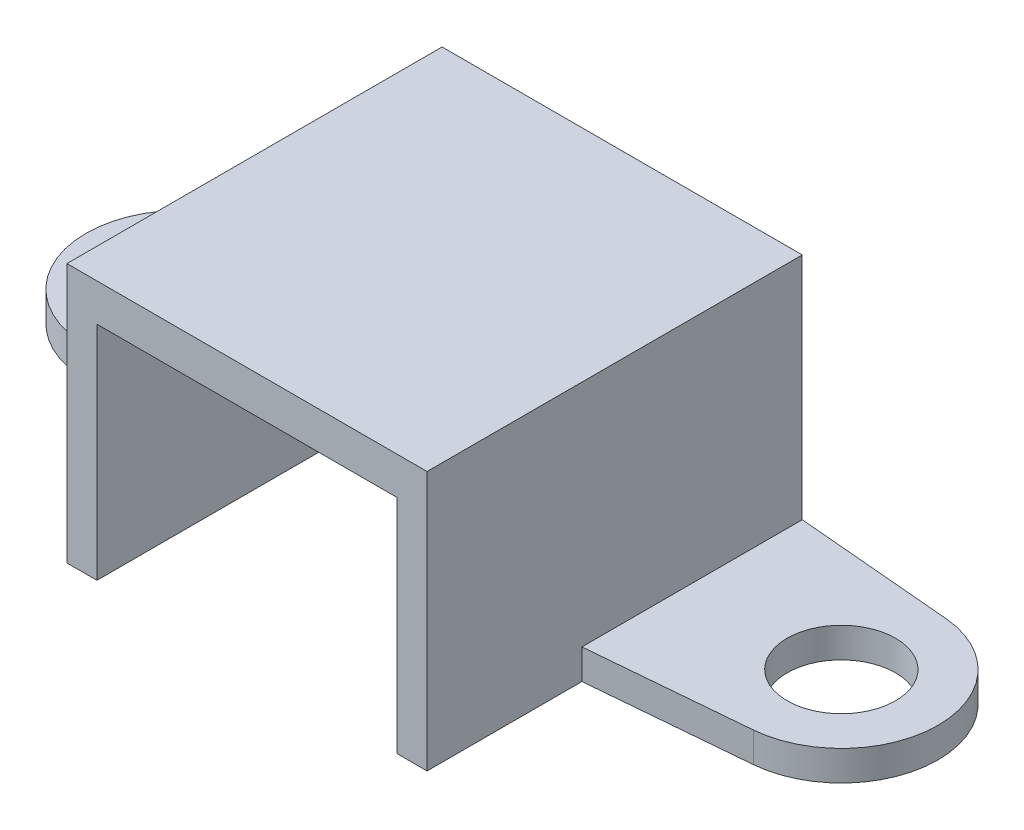
ISO-10303-21;
HEADER;
FILE_DESCRIPTION(('STEP AP214'),'2;1');
FILE_NAME('part.step','',(''),(''),'','','');
FILE_SCHEMA(('AUTOMOTIVE_DESIGN { 1 0 10303 214 1 1 1 1 }'));
ENDSEC;
DATA;
#1=APPLICATION_CONTEXT('core data for automotive mechanical design processes');
#2=APPLICATION_PROTOCOL_DEFINITION('international standard','automotive_design',2000,#1);
#3=PRODUCT_CONTEXT('',#1,'mechanical');
#4=PRODUCT('Part','Part','',(#3));
#5=PRODUCT_RELATED_PRODUCT_CATEGORY('part','',(#4));
#6=PRODUCT_DEFINITION_FORMATION('','',#4);
#7=PRODUCT_DEFINITION_CONTEXT('part definition',#1,'design');
#8=PRODUCT_DEFINITION('design','',#6,#7);
#9=PRODUCT_DEFINITION_SHAPE('','',#8);
#10=(LENGTH_UNIT() NAMED_UNIT(*) SI_UNIT(.MILLI.,.METRE.));
#11=(NAMED_UNIT(*) PLANE_ANGLE_UNIT() SI_UNIT($,.RADIAN.));
#12=(NAMED_UNIT(*) SI_UNIT($,.STERADIAN.) SOLID_ANGLE_UNIT());
#13=UNCERTAINTY_MEASURE_WITH_UNIT(LENGTH_MEASURE(1.E-05),#10,'distance_accuracy_value','');
#14=(GEOMETRIC_REPRESENTATION_CONTEXT(3) GLOBAL_UNCERTAINTY_ASSIGNED_CONTEXT((#13)) GLOBAL_UNIT_ASSIGNED_CONTEXT((#10,
#11,#12)) REPRESENTATION_CONTEXT('',''));
#15=CARTESIAN_POINT('',(0.,0.,0.));
#16=DIRECTION('',(0.,0.,1.));
#17=DIRECTION('',(1.,0.,0.));
#18=AXIS2_PLACEMENT_3D('',#15,#16,#17);
#19=CARTESIAN_POINT('',(1.2,0.,-15.));
#20=DIRECTION('',(0.,-1.,0.));
#21=DIRECTION('',(0.,0.,-1.));
#22=AXIS2_PLACEMENT_3D('',#19,#20,#21);
#23=PLANE('',#22);
#24=DIRECTION('',(1.,0.,0.));
#25=VECTOR('',#24,1.);
#26=CARTESIAN_POINT('',(1.2,0.,0.));
#27=LINE('',#26,#25);
#28=CARTESIAN_POINT('',(0.,0.,0.));
#29=VERTEX_POINT('',#28);
#30=CARTESIAN_POINT('',(1.2,0.,0.));
#31=VERTEX_POINT('',#30);
#32=EDGE_CURVE('E213',#29,#31,#27,.T.);
#33=ORIENTED_EDGE('',*,*,#32,.F.);
#34=DIRECTION('',(0.,0.,1.));
#35=VECTOR('',#34,1.);
#36=CARTESIAN_POINT('',(0.,0.,-15.));
#37=LINE('',#36,#35);
#38=CARTESIAN_POINT('',(0.,0.,-6.19105792955098));
#39=VERTEX_POINT('',#38);
#40=EDGE_CURVE('E11',#39,#29,#37,.T.);
#41=ORIENTED_EDGE('',*,*,#40,.F.);
#42=DIRECTION('',(-0.996194698091746,0.,-0.0871557427476585));
#43=VECTOR('',#42,1.);
#44=CARTESIAN_POINT('',(0.537532963648466,0.,-6.14402988896025));
#45=LINE('',#44,#43);
#46=CARTESIAN_POINT('',(-6.30468363341923,0.,-6.7426462745926));
#47=VERTEX_POINT('',#46);
#48=EDGE_CURVE('E55',#39,#47,#45,.T.);
#49=ORIENTED_EDGE('',*,*,#48,.T.);
#50=CARTESIAN_POINT('',(-5.96760007613296,0.,-10.5955289647755));
#51=DIRECTION('',(0.,-1.,0.));
#52=DIRECTION('',(0.,0.,-1.));
#53=AXIS2_PLACEMENT_3D('',#50,#51,#52);
#54=CIRCLE('',#53,3.86760007613296);
#55=CARTESIAN_POINT('',(-6.30468363341923,0.,-14.4484116549584));
#56=VERTEX_POINT('',#55);
#57=EDGE_CURVE('E152',#47,#56,#54,.T.);
#58=ORIENTED_EDGE('',*,*,#57,.T.);
#59=DIRECTION('',(-0.996194698091746,0.,0.0871557427476585));
#60=VECTOR('',#59,1.);
#61=CARTESIAN_POINT('',(-1.30236133250198,0.,-14.8860581475916));
#62=LINE('',#61,#60);
#63=CARTESIAN_POINT('',(0.,0.,-15.));
#64=VERTEX_POINT('',#63);
#65=EDGE_CURVE('E171',#64,#56,#62,.T.);
#66=ORIENTED_EDGE('',*,*,#65,.F.);
#67=DIRECTION('',(1.,0.,0.));
#68=VECTOR('',#67,1.);
#69=CARTESIAN_POINT('',(1.2,0.,-15.));
#70=LINE('',#69,#68);
#71=CARTESIAN_POINT('',(1.2,0.,-15.));
#72=VERTEX_POINT('',#71);
#73=EDGE_CURVE('E218',#64,#72,#70,.T.);
#74=ORIENTED_EDGE('',*,*,#73,.T.);
#75=DIRECTION('',(0.,0.,1.));
#76=VECTOR('',#75,1.);
#77=CARTESIAN_POINT('',(1.2,0.,-15.));
#78=LINE('',#77,#76);
#79=EDGE_CURVE('E42',#72,#31,#78,.T.);
#80=ORIENTED_EDGE('',*,*,#79,.T.);
#81=EDGE_LOOP('',(#33,#41,#49,#58,#66,#74,#80));
#82=FACE_BOUND('',#81,.T.);
#83=CARTESIAN_POINT('',(-5.96760007613296,0.,-10.5955289647755));
#84=DIRECTION('',(0.,-1.,0.));
#85=DIRECTION('',(0.,0.,-1.));
#86=AXIS2_PLACEMENT_3D('',#83,#84,#85);
#87=CIRCLE('',#86,2.16760007613296);
#88=CARTESIAN_POINT('',(-5.96760007613296,0.,-12.7631290409085));
#89=VERTEX_POINT('',#88);
#90=EDGE_CURVE('E176',#89,#89,#87,.T.);
#91=ORIENTED_EDGE('',*,*,#90,.F.);
#92=EDGE_LOOP('',(#91));
#93=FACE_BOUND('',#92,.T.);
#94=ADVANCED_FACE('F39',(#82,#93),#23,.T.);
#95=CARTESIAN_POINT('',(0.,0.,-15.));
#96=DIRECTION('',(-1.,0.,0.));
#97=DIRECTION('',(0.,0.,1.));
#98=AXIS2_PLACEMENT_3D('',#95,#96,#97);
#99=PLANE('',#98);
#100=DIRECTION('',(0.,0.,-1.));
#101=VECTOR('',#100,1.);
#102=CARTESIAN_POINT('',(0.,1.2,0.));
#103=LINE('',#102,#101);
#104=CARTESIAN_POINT('',(0.,1.2,-6.19105792955098));
#105=VERTEX_POINT('',#104);
#106=CARTESIAN_POINT('',(0.,1.2,-15.));
#107=VERTEX_POINT('',#106);
#108=EDGE_CURVE('E155',#105,#107,#103,.T.);
#109=ORIENTED_EDGE('',*,*,#108,.F.);
#110=DIRECTION('',(0.,-1.,0.));
#111=VECTOR('',#110,1.);
#112=CARTESIAN_POINT('',(0.,1.2,-6.19105792955098));
#113=LINE('',#112,#111);
#114=EDGE_CURVE('E167',#105,#39,#113,.T.);
#115=ORIENTED_EDGE('',*,*,#114,.T.);
#116=ORIENTED_EDGE('',*,*,#40,.T.);
#117=DIRECTION('',(0.,-1.,0.));
#118=VECTOR('',#117,1.);
#119=CARTESIAN_POINT('',(0.,0.,0.));
#120=LINE('',#119,#118);
#121=CARTESIAN_POINT('',(0.,10.3693199609435,0.));
#122=VERTEX_POINT('',#121);
#123=EDGE_CURVE('E222',#122,#29,#120,.T.);
#124=ORIENTED_EDGE('',*,*,#123,.F.);
#125=DIRECTION('',(0.,0.,1.));
#126=VECTOR('',#125,1.);
#127=CARTESIAN_POINT('',(0.,10.3693199609435,-15.));
#128=LINE('',#127,#126);
#129=CARTESIAN_POINT('',(0.,10.3693199609435,-15.));
#130=VERTEX_POINT('',#129);
#131=EDGE_CURVE('E47',#130,#122,#128,.T.);
#132=ORIENTED_EDGE('',*,*,#131,.F.);
#133=DIRECTION('',(0.,-1.,0.));
#134=VECTOR('',#133,1.);
#135=CARTESIAN_POINT('',(0.,0.,-15.));
#136=LINE('',#135,#134);
#137=EDGE_CURVE('E240',#130,#107,#136,.T.);
#138=ORIENTED_EDGE('',*,*,#137,.T.);
#139=EDGE_LOOP('',(#109,#115,#116,#124,#132,#138));
#140=FACE_BOUND('',#139,.T.);
#141=ADVANCED_FACE('F289',(#140),#99,.T.);
#142=CARTESIAN_POINT('',(0.,10.3693199609435,-15.));
#143=DIRECTION('',(0.,1.,0.));
#144=DIRECTION('',(0.,0.,1.));
#145=AXIS2_PLACEMENT_3D('',#142,#143,#144);
#146=PLANE('',#145);
#147=DIRECTION('',(-1.,0.,0.));
#148=VECTOR('',#147,1.);
#149=CARTESIAN_POINT('',(0.,10.3693199609435,0.));
#150=LINE('',#149,#148);
#151=CARTESIAN_POINT('',(14.4,10.3693199609435,0.));
#152=VERTEX_POINT('',#151);
#153=EDGE_CURVE('E260',#152,#122,#150,.T.);
#154=ORIENTED_EDGE('',*,*,#153,.F.);
#155=DIRECTION('',(0.,0.,1.));
#156=VECTOR('',#155,1.);
#157=CARTESIAN_POINT('',(14.4,10.3693199609435,-15.));
#158=LINE('',#157,#156);
#159=CARTESIAN_POINT('',(14.4,10.3693199609435,-15.));
#160=VERTEX_POINT('',#159);
#161=EDGE_CURVE('E266',#160,#152,#158,.T.);
#162=ORIENTED_EDGE('',*,*,#161,.F.);
#163=DIRECTION('',(-1.,0.,0.));
#164=VECTOR('',#163,1.);
#165=CARTESIAN_POINT('',(0.,10.3693199609435,-15.));
#166=LINE('',#165,#164);
#167=EDGE_CURVE('E237',#160,#130,#166,.T.);
#168=ORIENTED_EDGE('',*,*,#167,.T.);
#169=ORIENTED_EDGE('',*,*,#131,.T.);
#170=EDGE_LOOP('',(#154,#162,#168,#169));
#171=FACE_BOUND('',#170,.T.);
#172=ADVANCED_FACE('F319',(#171),#146,.T.);
#173=CARTESIAN_POINT('',(14.4,10.3693199609435,-15.));
#174=DIRECTION('',(1.,0.,0.));
#175=DIRECTION('',(0.,1.,0.));
#176=AXIS2_PLACEMENT_3D('',#173,#174,#175);
#177=PLANE('',#176);
#178=DIRECTION('',(0.,-1.,0.));
#179=VECTOR('',#178,1.);
#180=CARTESIAN_POINT('',(14.4,1.2,-6.19105792955098));
#181=LINE('',#180,#179);
#182=CARTESIAN_POINT('',(14.4,1.2,-6.19105792955098));
#183=VERTEX_POINT('',#182);
#184=CARTESIAN_POINT('',(14.4,0.,-6.19105792955098));
#185=VERTEX_POINT('',#184);
#186=EDGE_CURVE('E214',#183,#185,#181,.T.);
#187=ORIENTED_EDGE('',*,*,#186,.F.);
#188=DIRECTION('',(0.,0.,-1.));
#189=VECTOR('',#188,1.);
#190=CARTESIAN_POINT('',(14.4,1.2,0.));
#191=LINE('',#190,#189);
#192=CARTESIAN_POINT('',(14.4,1.2,-15.));
#193=VERTEX_POINT('',#192);
#194=EDGE_CURVE('E194',#183,#193,#191,.T.);
#195=ORIENTED_EDGE('',*,*,#194,.T.);
#196=DIRECTION('',(0.,1.,0.));
#197=VECTOR('',#196,1.);
#198=CARTESIAN_POINT('',(14.4,10.3693199609435,-15.));
#199=LINE('',#198,#197);
#200=EDGE_CURVE('E234',#193,#160,#199,.T.);
#201=ORIENTED_EDGE('',*,*,#200,.T.);
#202=ORIENTED_EDGE('',*,*,#161,.T.);
#203=DIRECTION('',(0.,1.,0.));
#204=VECTOR('',#203,1.);
#205=CARTESIAN_POINT('',(14.4,10.3693199609435,0.));
#206=LINE('',#205,#204);
#207=CARTESIAN_POINT('',(14.4,0.,0.));
#208=VERTEX_POINT('',#207);
#209=EDGE_CURVE('E257',#208,#152,#206,.T.);
#210=ORIENTED_EDGE('',*,*,#209,.F.);
#211=DIRECTION('',(0.,0.,1.));
#212=VECTOR('',#211,1.);
#213=CARTESIAN_POINT('',(14.4,0.,-15.));
#214=LINE('',#213,#212);
#215=EDGE_CURVE('E268',#185,#208,#214,.T.);
#216=ORIENTED_EDGE('',*,*,#215,.F.);
#217=EDGE_LOOP('',(#187,#195,#201,#202,#210,#216));
#218=FACE_BOUND('',#217,.T.);
#219=ADVANCED_FACE('F314',(#218),#177,.T.);
#220=CARTESIAN_POINT('',(14.4,0.,-15.));
#221=DIRECTION('',(0.,-1.,0.));
#222=DIRECTION('',(1.,0.,0.));
#223=AXIS2_PLACEMENT_3D('',#220,#221,#222);
#224=PLANE('',#223);
#225=DIRECTION('',(1.,0.,0.));
#226=VECTOR('',#225,1.);
#227=CARTESIAN_POINT('',(14.4,0.,0.));
#228=LINE('',#227,#226);
#229=CARTESIAN_POINT('',(13.2,0.,0.));
#230=VERTEX_POINT('',#229);
#231=EDGE_CURVE('E254',#230,#208,#228,.T.);
#232=ORIENTED_EDGE('',*,*,#231,.F.);
#233=DIRECTION('',(0.,0.,1.));
#234=VECTOR('',#233,1.);
#235=CARTESIAN_POINT('',(13.2,0.,-15.));
#236=LINE('',#235,#234);
#237=CARTESIAN_POINT('',(13.2,0.,-15.));
#238=VERTEX_POINT('',#237);
#239=EDGE_CURVE('E270',#238,#230,#236,.T.);
#240=ORIENTED_EDGE('',*,*,#239,.F.);
#241=DIRECTION('',(1.,0.,0.));
#242=VECTOR('',#241,1.);
#243=CARTESIAN_POINT('',(14.4,0.,-15.));
#244=LINE('',#243,#242);
#245=CARTESIAN_POINT('',(14.4,0.,-15.));
#246=VERTEX_POINT('',#245);
#247=EDGE_CURVE('E231',#238,#246,#244,.T.);
#248=ORIENTED_EDGE('',*,*,#247,.T.);
#249=DIRECTION('',(0.996194698091746,0.,0.0871557427476585));
#250=VECTOR('',#249,1.);
#251=CARTESIAN_POINT('',(1.41174551081408,0.,-16.1363250267935));
#252=LINE('',#251,#250);
#253=CARTESIAN_POINT('',(20.7046836334192,0.,-14.4484116549584));
#254=VERTEX_POINT('',#253);
#255=EDGE_CURVE('E206',#246,#254,#252,.T.);
#256=ORIENTED_EDGE('',*,*,#255,.T.);
#257=CARTESIAN_POINT('',(20.367600076133,0.,-10.5955289647755));
#258=DIRECTION('',(0.,-1.,0.));
#259=DIRECTION('',(0.,0.,-1.));
#260=AXIS2_PLACEMENT_3D('',#257,#258,#259);
#261=CIRCLE('',#260,3.86760007613296);
#262=CARTESIAN_POINT('',(20.7046836334192,0.,-6.7426462745926));
#263=VERTEX_POINT('',#262);
#264=EDGE_CURVE('E184',#263,#254,#261,.F.);
#265=ORIENTED_EDGE('',*,*,#264,.F.);
#266=DIRECTION('',(0.996194698091746,0.,-0.0871557427476585));
#267=VECTOR('',#266,1.);
#268=CARTESIAN_POINT('',(-0.428148785336363,0.,-4.89376300975835));
#269=LINE('',#268,#267);
#270=EDGE_CURVE('E204',#185,#263,#269,.T.);
#271=ORIENTED_EDGE('',*,*,#270,.F.);
#272=ORIENTED_EDGE('',*,*,#215,.T.);
#273=EDGE_LOOP('',(#232,#240,#248,#256,#265,#271,#272));
#274=FACE_BOUND('',#273,.T.);
#275=CARTESIAN_POINT('',(20.367600076133,0.,-10.5955289647755));
#276=DIRECTION('',(0.,-1.,0.));
#277=DIRECTION('',(0.,0.,-1.));
#278=AXIS2_PLACEMENT_3D('',#275,#276,#277);
#279=CIRCLE('',#278,2.16760007613296);
#280=CARTESIAN_POINT('',(20.367600076133,0.,-12.7631290409085));
#281=VERTEX_POINT('',#280);
#282=EDGE_CURVE('E192',#281,#281,#279,.F.);
#283=ORIENTED_EDGE('',*,*,#282,.T.);
#284=EDGE_LOOP('',(#283));
#285=FACE_BOUND('',#284,.T.);
#286=ADVANCED_FACE('F306',(#274,#285),#224,.T.);
#287=CARTESIAN_POINT('',(13.2,0.,-15.));
#288=DIRECTION('',(-1.,0.,0.));
#289=DIRECTION('',(0.,-1.,0.));
#290=AXIS2_PLACEMENT_3D('',#287,#288,#289);
#291=PLANE('',#290);
#292=DIRECTION('',(0.,-1.,0.));
#293=VECTOR('',#292,1.);
#294=CARTESIAN_POINT('',(13.2,0.,0.));
#295=LINE('',#294,#293);
#296=CARTESIAN_POINT('',(13.2,8.86931996094346,0.));
#297=VERTEX_POINT('',#296);
#298=EDGE_CURVE('E251',#297,#230,#295,.T.);
#299=ORIENTED_EDGE('',*,*,#298,.F.);
#300=DIRECTION('',(0.,0.,1.));
#301=VECTOR('',#300,1.);
#302=CARTESIAN_POINT('',(13.2,8.86931996094346,-15.));
#303=LINE('',#302,#301);
#304=CARTESIAN_POINT('',(13.2,8.86931996094346,-15.));
#305=VERTEX_POINT('',#304);
#306=EDGE_CURVE('E272',#305,#297,#303,.T.);
#307=ORIENTED_EDGE('',*,*,#306,.F.);
#308=DIRECTION('',(0.,-1.,0.));
#309=VECTOR('',#308,1.);
#310=CARTESIAN_POINT('',(13.2,0.,-15.));
#311=LINE('',#310,#309);
#312=EDGE_CURVE('E228',#305,#238,#311,.T.);
#313=ORIENTED_EDGE('',*,*,#312,.T.);
#314=ORIENTED_EDGE('',*,*,#239,.T.);
#315=EDGE_LOOP('',(#299,#307,#313,#314));
#316=FACE_BOUND('',#315,.T.);
#317=ADVANCED_FACE('F304',(#316),#291,.T.);
#318=CARTESIAN_POINT('',(13.2,8.86931996094346,-15.));
#319=DIRECTION('',(0.,-1.,0.));
#320=DIRECTION('',(1.,0.,0.));
#321=AXIS2_PLACEMENT_3D('',#318,#319,#320);
#322=PLANE('',#321);
#323=DIRECTION('',(1.,0.,0.));
#324=VECTOR('',#323,1.);
#325=CARTESIAN_POINT('',(13.2,8.86931996094346,0.));
#326=LINE('',#325,#324);
#327=CARTESIAN_POINT('',(1.2,8.86931996094346,0.));
#328=VERTEX_POINT('',#327);
#329=EDGE_CURVE('E248',#328,#297,#326,.T.);
#330=ORIENTED_EDGE('',*,*,#329,.F.);
#331=DIRECTION('',(0.,0.,1.));
#332=VECTOR('',#331,1.);
#333=CARTESIAN_POINT('',(1.2,8.86931996094346,-15.));
#334=LINE('',#333,#332);
#335=CARTESIAN_POINT('',(1.2,8.86931996094346,-15.));
#336=VERTEX_POINT('',#335);
#337=EDGE_CURVE('E273',#336,#328,#334,.T.);
#338=ORIENTED_EDGE('',*,*,#337,.F.);
#339=DIRECTION('',(1.,0.,0.));
#340=VECTOR('',#339,1.);
#341=CARTESIAN_POINT('',(13.2,8.86931996094346,-15.));
#342=LINE('',#341,#340);
#343=EDGE_CURVE('E225',#336,#305,#342,.T.);
#344=ORIENTED_EDGE('',*,*,#343,.T.);
#345=ORIENTED_EDGE('',*,*,#306,.T.);
#346=EDGE_LOOP('',(#330,#338,#344,#345));
#347=FACE_BOUND('',#346,.T.);
#348=ADVANCED_FACE('F300',(#347),#322,.T.);
#349=CARTESIAN_POINT('',(1.2,8.86931996094346,-15.));
#350=DIRECTION('',(1.,0.,0.));
#351=DIRECTION('',(0.,1.,0.));
#352=AXIS2_PLACEMENT_3D('',#349,#350,#351);
#353=PLANE('',#352);
#354=DIRECTION('',(0.,1.,0.));
#355=VECTOR('',#354,1.);
#356=CARTESIAN_POINT('',(1.2,8.86931996094346,0.));
#357=LINE('',#356,#355);
#358=EDGE_CURVE('E245',#31,#328,#357,.T.);
#359=ORIENTED_EDGE('',*,*,#358,.F.);
#360=ORIENTED_EDGE('',*,*,#79,.F.);
#361=DIRECTION('',(0.,1.,0.));
#362=VECTOR('',#361,1.);
#363=CARTESIAN_POINT('',(1.2,8.86931996094346,-15.));
#364=LINE('',#363,#362);
#365=EDGE_CURVE('E221',#72,#336,#364,.T.);
#366=ORIENTED_EDGE('',*,*,#365,.T.);
#367=ORIENTED_EDGE('',*,*,#337,.T.);
#368=EDGE_LOOP('',(#359,#360,#366,#367));
#369=FACE_BOUND('',#368,.T.);
#370=ADVANCED_FACE('F283',(#369),#353,.T.);
#371=CARTESIAN_POINT('',(0.,0.,-15.));
#372=DIRECTION('',(0.,0.,-1.));
#373=DIRECTION('',(-1.,0.,0.));
#374=AXIS2_PLACEMENT_3D('',#371,#372,#373);
#375=PLANE('',#374);
#376=ORIENTED_EDGE('',*,*,#73,.F.);
#377=DIRECTION('',(0.,-1.,0.));
#378=VECTOR('',#377,1.);
#379=CARTESIAN_POINT('',(0.,1.2,-15.));
#380=LINE('',#379,#378);
#381=EDGE_CURVE('E185',#107,#64,#380,.T.);
#382=ORIENTED_EDGE('',*,*,#381,.F.);
#383=ORIENTED_EDGE('',*,*,#137,.F.);
#384=ORIENTED_EDGE('',*,*,#167,.F.);
#385=ORIENTED_EDGE('',*,*,#200,.F.);
#386=EDGE_CURVE('E235',#246,#193,#199,.T.);
#387=ORIENTED_EDGE('',*,*,#386,.F.);
#388=ORIENTED_EDGE('',*,*,#247,.F.);
#389=ORIENTED_EDGE('',*,*,#312,.F.);
#390=ORIENTED_EDGE('',*,*,#343,.F.);
#391=ORIENTED_EDGE('',*,*,#365,.F.);
#392=EDGE_LOOP('',(#376,#382,#383,#384,#385,#387,#388,#389,#390,#391));
#393=FACE_BOUND('',#392,.T.);
#394=ADVANCED_FACE('F295',(#393),#375,.T.);
#395=CARTESIAN_POINT('',(0.,0.,0.));
#396=DIRECTION('',(0.,0.,-1.));
#397=DIRECTION('',(-1.,0.,0.));
#398=AXIS2_PLACEMENT_3D('',#395,#396,#397);
#399=PLANE('',#398);
#400=ORIENTED_EDGE('',*,*,#32,.T.);
#401=ORIENTED_EDGE('',*,*,#358,.T.);
#402=ORIENTED_EDGE('',*,*,#329,.T.);
#403=ORIENTED_EDGE('',*,*,#298,.T.);
#404=ORIENTED_EDGE('',*,*,#231,.T.);
#405=ORIENTED_EDGE('',*,*,#209,.T.);
#406=ORIENTED_EDGE('',*,*,#153,.T.);
#407=ORIENTED_EDGE('',*,*,#123,.T.);
#408=EDGE_LOOP('',(#400,#401,#402,#403,#404,#405,#406,#407));
#409=FACE_BOUND('',#408,.T.);
#410=ADVANCED_FACE('F285',(#409),#399,.F.);
#411=CARTESIAN_POINT('',(20.367600076133,1.2,-10.5955289647755));
#412=DIRECTION('',(0.,-1.,0.));
#413=DIRECTION('',(0.,0.,-1.));
#414=AXIS2_PLACEMENT_3D('',#411,#412,#413);
#415=CYLINDRICAL_SURFACE('',#414,3.86760007613296);
#416=ORIENTED_EDGE('',*,*,#264,.T.);
#417=DIRECTION('',(0.,-1.,0.));
#418=VECTOR('',#417,1.);
#419=CARTESIAN_POINT('',(20.7046836334192,1.2,-14.4484116549584));
#420=LINE('',#419,#418);
#421=CARTESIAN_POINT('',(20.7046836334192,1.2,-14.4484116549584));
#422=VERTEX_POINT('',#421);
#423=EDGE_CURVE('E211',#422,#254,#420,.T.);
#424=ORIENTED_EDGE('',*,*,#423,.F.);
#425=CARTESIAN_POINT('',(20.367600076133,1.2,-10.5955289647755));
#426=DIRECTION('',(0.,-1.,0.));
#427=DIRECTION('',(0.,0.,-1.));
#428=AXIS2_PLACEMENT_3D('',#425,#426,#427);
#429=CIRCLE('',#428,3.86760007613296);
#430=CARTESIAN_POINT('',(20.7046836334192,1.2,-6.7426462745926));
#431=VERTEX_POINT('',#430);
#432=EDGE_CURVE('E189',#431,#422,#429,.F.);
#433=ORIENTED_EDGE('',*,*,#432,.F.);
#434=DIRECTION('',(0.,-1.,0.));
#435=VECTOR('',#434,1.);
#436=CARTESIAN_POINT('',(20.7046836334192,1.2,-6.7426462745926));
#437=LINE('',#436,#435);
#438=EDGE_CURVE('E201',#431,#263,#437,.T.);
#439=ORIENTED_EDGE('',*,*,#438,.T.);
#440=EDGE_LOOP('',(#416,#424,#433,#439));
#441=FACE_BOUND('',#440,.T.);
#442=ADVANCED_FACE('F326',(#441),#415,.T.);
#443=CARTESIAN_POINT('',(1.41174551081408,1.2,-16.1363250267935));
#444=DIRECTION('',(0.0871557427476585,0.,-0.996194698091745));
#445=DIRECTION('',(-0.996194698091746,0.,-0.0871557427476585));
#446=AXIS2_PLACEMENT_3D('',#443,#444,#445);
#447=PLANE('',#446);
#448=ORIENTED_EDGE('',*,*,#255,.F.);
#449=ORIENTED_EDGE('',*,*,#386,.T.);
#450=DIRECTION('',(0.996194698091746,0.,0.0871557427476585));
#451=VECTOR('',#450,1.);
#452=CARTESIAN_POINT('',(1.41174551081408,1.2,-16.1363250267935));
#453=LINE('',#452,#451);
#454=EDGE_CURVE('E63',#193,#422,#453,.T.);
#455=ORIENTED_EDGE('',*,*,#454,.T.);
#456=ORIENTED_EDGE('',*,*,#423,.T.);
#457=EDGE_LOOP('',(#448,#449,#455,#456));
#458=FACE_BOUND('',#457,.T.);
#459=ADVANCED_FACE('F322',(#458),#447,.T.);
#460=CARTESIAN_POINT('',(-0.428148785336363,1.2,-4.89376300975835));
#461=DIRECTION('',(-0.0871557427476585,0.,-0.996194698091745));
#462=DIRECTION('',(-0.996194698091746,0.,0.0871557427476585));
#463=AXIS2_PLACEMENT_3D('',#460,#461,#462);
#464=PLANE('',#463);
#465=ORIENTED_EDGE('',*,*,#270,.T.);
#466=ORIENTED_EDGE('',*,*,#438,.F.);
#467=DIRECTION('',(0.996194698091746,0.,-0.0871557427476585));
#468=VECTOR('',#467,1.);
#469=CARTESIAN_POINT('',(-0.428148785336363,1.2,-4.89376300975835));
#470=LINE('',#469,#468);
#471=EDGE_CURVE('E191',#183,#431,#470,.T.);
#472=ORIENTED_EDGE('',*,*,#471,.F.);
#473=ORIENTED_EDGE('',*,*,#186,.T.);
#474=EDGE_LOOP('',(#465,#466,#472,#473));
#475=FACE_BOUND('',#474,.T.);
#476=ADVANCED_FACE('F329',(#475),#464,.F.);
#477=CARTESIAN_POINT('',(20.367600076133,1.2,-10.5955289647755));
#478=DIRECTION('',(0.,-1.,0.));
#479=DIRECTION('',(0.,0.,-1.));
#480=AXIS2_PLACEMENT_3D('',#477,#478,#479);
#481=CYLINDRICAL_SURFACE('',#480,2.16760007613296);
#482=CARTESIAN_POINT('',(20.367600076133,1.2,-10.5955289647755));
#483=DIRECTION('',(0.,-1.,0.));
#484=DIRECTION('',(0.,0.,-1.));
#485=AXIS2_PLACEMENT_3D('',#482,#483,#484);
#486=CIRCLE('',#485,2.16760007613296);
#487=CARTESIAN_POINT('',(20.367600076133,1.2,-12.7631290409085));
#488=VERTEX_POINT('',#487);
#489=EDGE_CURVE('E198',#488,#488,#486,.F.);
#490=ORIENTED_EDGE('',*,*,#489,.T.);
#491=EDGE_LOOP('',(#490));
#492=FACE_BOUND('',#491,.T.);
#493=ORIENTED_EDGE('',*,*,#282,.F.);
#494=EDGE_LOOP('',(#493));
#495=FACE_BOUND('',#494,.T.);
#496=ADVANCED_FACE('F333',(#492,#495),#481,.F.);
#497=CARTESIAN_POINT('',(0.,1.2,0.));
#498=DIRECTION('',(0.,-1.,0.));
#499=DIRECTION('',(0.,0.,-1.));
#500=AXIS2_PLACEMENT_3D('',#497,#498,#499);
#501=PLANE('',#500);
#502=ORIENTED_EDGE('',*,*,#432,.T.);
#503=ORIENTED_EDGE('',*,*,#454,.F.);
#504=ORIENTED_EDGE('',*,*,#194,.F.);
#505=ORIENTED_EDGE('',*,*,#471,.T.);
#506=EDGE_LOOP('',(#502,#503,#504,#505));
#507=FACE_BOUND('',#506,.T.);
#508=ORIENTED_EDGE('',*,*,#489,.F.);
#509=EDGE_LOOP('',(#508));
#510=FACE_BOUND('',#509,.T.);
#511=ADVANCED_FACE('F330',(#507,#510),#501,.F.);
#512=CARTESIAN_POINT('',(0.537532963648466,1.2,-6.14402988896025));
#513=DIRECTION('',(-0.0871557427476585,0.,0.996194698091745));
#514=DIRECTION('',(0.996194698091746,0.,0.0871557427476585));
#515=AXIS2_PLACEMENT_3D('',#512,#513,#514);
#516=PLANE('',#515);
#517=ORIENTED_EDGE('',*,*,#48,.F.);
#518=ORIENTED_EDGE('',*,*,#114,.F.);
#519=DIRECTION('',(-0.996194698091746,0.,-0.0871557427476585));
#520=VECTOR('',#519,1.);
#521=CARTESIAN_POINT('',(0.537532963648466,1.2,-6.14402988896025));
#522=LINE('',#521,#520);
#523=CARTESIAN_POINT('',(-6.30468363341923,1.2,-6.7426462745926));
#524=VERTEX_POINT('',#523);
#525=EDGE_CURVE('E161',#105,#524,#522,.T.);
#526=ORIENTED_EDGE('',*,*,#525,.T.);
#527=DIRECTION('',(0.,-1.,0.));
#528=VECTOR('',#527,1.);
#529=CARTESIAN_POINT('',(-6.30468363341923,1.2,-6.7426462745926));
#530=LINE('',#529,#528);
#531=EDGE_CURVE('E147',#524,#47,#530,.T.);
#532=ORIENTED_EDGE('',*,*,#531,.T.);
#533=EDGE_LOOP('',(#517,#518,#526,#532));
#534=FACE_BOUND('',#533,.T.);
#535=ADVANCED_FACE('F166',(#534),#516,.T.);
#536=CARTESIAN_POINT('',(-1.30236133250198,1.2,-14.8860581475916));
#537=DIRECTION('',(0.0871557427476585,0.,0.996194698091745));
#538=DIRECTION('',(0.996194698091746,0.,-0.0871557427476585));
#539=AXIS2_PLACEMENT_3D('',#536,#537,#538);
#540=PLANE('',#539);
#541=ORIENTED_EDGE('',*,*,#65,.T.);
#542=DIRECTION('',(0.,-1.,0.));
#543=VECTOR('',#542,1.);
#544=CARTESIAN_POINT('',(-6.30468363341923,1.2,-14.4484116549584));
#545=LINE('',#544,#543);
#546=CARTESIAN_POINT('',(-6.30468363341923,1.2,-14.4484116549584));
#547=VERTEX_POINT('',#546);
#548=EDGE_CURVE('E154',#547,#56,#545,.T.);
#549=ORIENTED_EDGE('',*,*,#548,.F.);
#550=DIRECTION('',(-0.996194698091746,0.,0.0871557427476585));
#551=VECTOR('',#550,1.);
#552=CARTESIAN_POINT('',(-1.30236133250198,1.2,-14.8860581475916));
#553=LINE('',#552,#551);
#554=EDGE_CURVE('E163',#107,#547,#553,.T.);
#555=ORIENTED_EDGE('',*,*,#554,.F.);
#556=ORIENTED_EDGE('',*,*,#381,.T.);
#557=EDGE_LOOP('',(#541,#549,#555,#556));
#558=FACE_BOUND('',#557,.T.);
#559=ADVANCED_FACE('F292',(#558),#540,.F.);
#560=CARTESIAN_POINT('',(-5.96760007613296,1.2,-10.5955289647755));
#561=DIRECTION('',(0.,-1.,0.));
#562=DIRECTION('',(0.,0.,-1.));
#563=AXIS2_PLACEMENT_3D('',#560,#561,#562);
#564=CYLINDRICAL_SURFACE('',#563,2.16760007613296);
#565=CARTESIAN_POINT('',(-5.96760007613296,1.2,-10.5955289647755));
#566=DIRECTION('',(0.,-1.,0.));
#567=DIRECTION('',(0.,0.,-1.));
#568=AXIS2_PLACEMENT_3D('',#565,#566,#567);
#569=CIRCLE('',#568,2.16760007613296);
#570=CARTESIAN_POINT('',(-5.96760007613296,1.2,-12.7631290409085));
#571=VERTEX_POINT('',#570);
#572=EDGE_CURVE('E168',#571,#571,#569,.T.);
#573=ORIENTED_EDGE('',*,*,#572,.F.);
#574=EDGE_LOOP('',(#573));
#575=FACE_BOUND('',#574,.T.);
#576=ORIENTED_EDGE('',*,*,#90,.T.);
#577=EDGE_LOOP('',(#576));
#578=FACE_BOUND('',#577,.T.);
#579=ADVANCED_FACE('F369',(#575,#578),#564,.F.);
#580=CARTESIAN_POINT('',(-5.96760007613296,1.2,-10.5955289647755));
#581=DIRECTION('',(0.,-1.,0.));
#582=DIRECTION('',(0.,0.,-1.));
#583=AXIS2_PLACEMENT_3D('',#580,#581,#582);
#584=CYLINDRICAL_SURFACE('',#583,3.86760007613296);
#585=ORIENTED_EDGE('',*,*,#57,.F.);
#586=ORIENTED_EDGE('',*,*,#531,.F.);
#587=CARTESIAN_POINT('',(-5.96760007613296,1.2,-10.5955289647755));
#588=DIRECTION('',(0.,-1.,0.));
#589=DIRECTION('',(0.,0.,-1.));
#590=AXIS2_PLACEMENT_3D('',#587,#588,#589);
#591=CIRCLE('',#590,3.86760007613296);
#592=EDGE_CURVE('E150',#524,#547,#591,.T.);
#593=ORIENTED_EDGE('',*,*,#592,.T.);
#594=ORIENTED_EDGE('',*,*,#548,.T.);
#595=EDGE_LOOP('',(#585,#586,#593,#594));
#596=FACE_BOUND('',#595,.T.);
#597=ADVANCED_FACE('F149',(#596),#584,.T.);
#598=CARTESIAN_POINT('',(0.,1.2,0.));
#599=DIRECTION('',(0.,-1.,0.));
#600=DIRECTION('',(0.,0.,-1.));
#601=AXIS2_PLACEMENT_3D('',#598,#599,#600);
#602=PLANE('',#601);
#603=ORIENTED_EDGE('',*,*,#572,.T.);
#604=EDGE_LOOP('',(#603));
#605=FACE_BOUND('',#604,.T.);
#606=ORIENTED_EDGE('',*,*,#525,.F.);
#607=ORIENTED_EDGE('',*,*,#108,.T.);
#608=ORIENTED_EDGE('',*,*,#554,.T.);
#609=ORIENTED_EDGE('',*,*,#592,.F.);
#610=EDGE_LOOP('',(#606,#607,#608,#609));
#611=FACE_BOUND('',#610,.T.);
#612=ADVANCED_FACE('F159',(#605,#611),#602,.F.);
#613=CLOSED_SHELL('',(#94,#141,#172,#219,#286,#317,#348,#370,#394,#410,#442,#459,#476,#496,#511,
#535,#559,#579,#597,#612));
#614=MANIFOLD_SOLID_BREP('B2',#613);
#615=ADVANCED_BREP_SHAPE_REPRESENTATION('',(#18,#614),#14);
#616=SHAPE_DEFINITION_REPRESENTATION(#9,#615);
ENDSEC;
END-ISO-10303-21;
